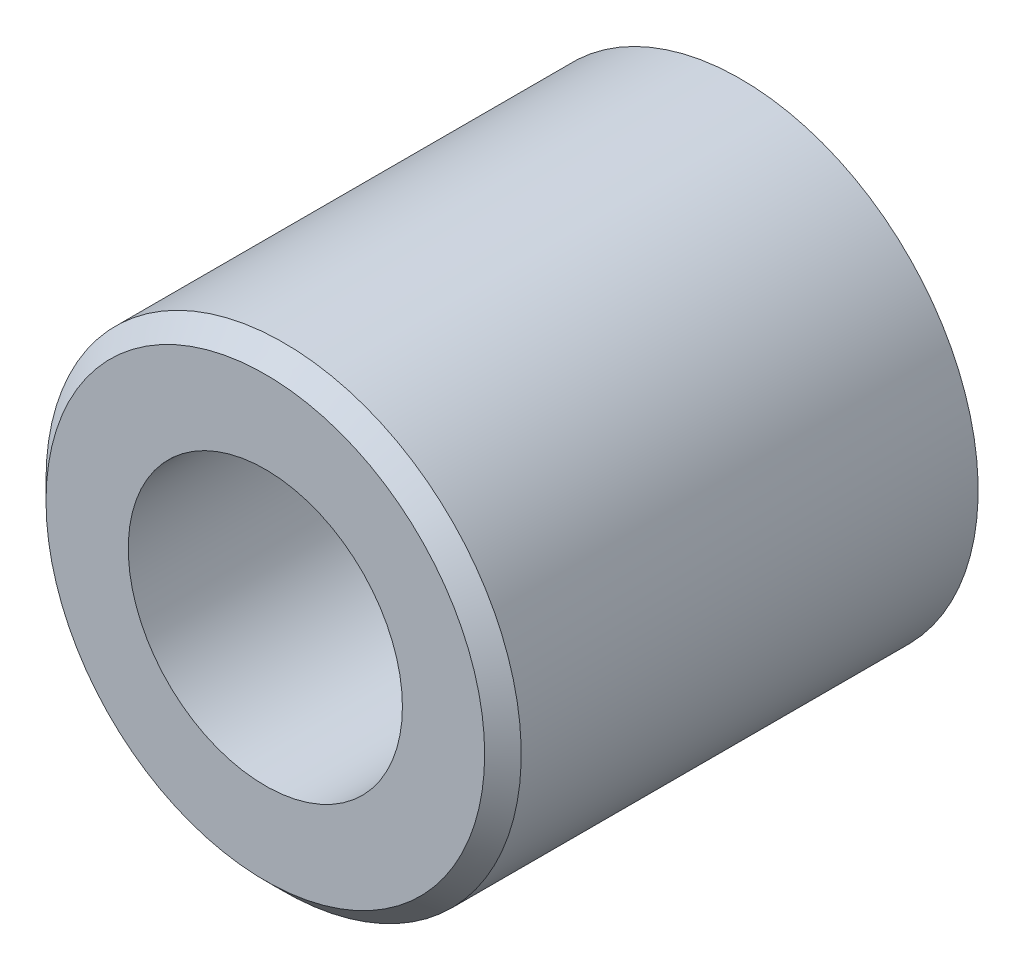
ISO-10303-21;
HEADER;
FILE_DESCRIPTION(('STEP AP214'),'2;1');
FILE_NAME('part.step','',(''),(''),'','','');
FILE_SCHEMA(('AUTOMOTIVE_DESIGN { 1 0 10303 214 1 1 1 1 }'));
ENDSEC;
DATA;
#1=APPLICATION_CONTEXT('core data for automotive mechanical design processes');
#2=APPLICATION_PROTOCOL_DEFINITION('international standard','automotive_design',2000,#1);
#3=PRODUCT_CONTEXT('',#1,'mechanical');
#4=PRODUCT('Part','Part','',(#3));
#5=PRODUCT_RELATED_PRODUCT_CATEGORY('part','',(#4));
#6=PRODUCT_DEFINITION_FORMATION('','',#4);
#7=PRODUCT_DEFINITION_CONTEXT('part definition',#1,'design');
#8=PRODUCT_DEFINITION('design','',#6,#7);
#9=PRODUCT_DEFINITION_SHAPE('','',#8);
#10=(LENGTH_UNIT() NAMED_UNIT(*) SI_UNIT(.MILLI.,.METRE.));
#11=(NAMED_UNIT(*) PLANE_ANGLE_UNIT() SI_UNIT($,.RADIAN.));
#12=(NAMED_UNIT(*) SI_UNIT($,.STERADIAN.) SOLID_ANGLE_UNIT());
#13=UNCERTAINTY_MEASURE_WITH_UNIT(LENGTH_MEASURE(1.E-05),#10,'distance_accuracy_value','');
#14=(GEOMETRIC_REPRESENTATION_CONTEXT(3) GLOBAL_UNCERTAINTY_ASSIGNED_CONTEXT((#13)) GLOBAL_UNIT_ASSIGNED_CONTEXT((#10,
#11,#12)) REPRESENTATION_CONTEXT('',''));
#15=CARTESIAN_POINT('',(0.,0.,0.));
#16=DIRECTION('',(0.,0.,1.));
#17=DIRECTION('',(1.,0.,0.));
#18=AXIS2_PLACEMENT_3D('',#15,#16,#17);
#19=CARTESIAN_POINT('',(0.,0.,0.));
#20=DIRECTION('',(0.,0.,1.));
#21=DIRECTION('',(1.,0.,0.));
#22=AXIS2_PLACEMENT_3D('',#19,#20,#21);
#23=CYLINDRICAL_SURFACE('',#22,3.);
#24=CARTESIAN_POINT('',(0.,0.,0.));
#25=DIRECTION('',(0.,0.,1.));
#26=DIRECTION('',(1.,0.,0.));
#27=AXIS2_PLACEMENT_3D('',#24,#25,#26);
#28=CIRCLE('',#27,3.);
#29=CARTESIAN_POINT('',(3.,0.,0.));
#30=VERTEX_POINT('',#29);
#31=EDGE_CURVE('E47',#30,#30,#28,.T.);
#32=CARTESIAN_POINT('',(0.,0.,5.));
#33=DIRECTION('',(0.,0.,1.));
#34=DIRECTION('',(1.,0.,0.));
#35=AXIS2_PLACEMENT_3D('',#32,#33,#34);
#36=CIRCLE('',#35,3.);
#37=CARTESIAN_POINT('',(3.,0.,5.));
#38=VERTEX_POINT('',#37);
#39=EDGE_CURVE('E38',#38,#38,#36,.F.);
#40=CARTESIAN_POINT('',(3.,0.,0.));
#41=CARTESIAN_POINT('',(3.,0.,0.0520833333333332));
#42=CARTESIAN_POINT('',(3.,0.,0.104166666666667));
#43=CARTESIAN_POINT('',(3.,0.,0.208333333333333));
#44=CARTESIAN_POINT('',(3.,0.,0.260416666666667));
#45=CARTESIAN_POINT('',(3.,0.,0.364583333333333));
#46=CARTESIAN_POINT('',(3.,0.,0.416666666666667));
#47=CARTESIAN_POINT('',(3.,0.,0.520833333333333));
#48=CARTESIAN_POINT('',(3.,0.,0.572916666666666));
#49=CARTESIAN_POINT('',(3.,0.,0.677083333333333));
#50=CARTESIAN_POINT('',(3.,0.,0.729166666666666));
#51=CARTESIAN_POINT('',(3.,0.,0.833333333333333));
#52=CARTESIAN_POINT('',(3.,0.,0.885416666666666));
#53=CARTESIAN_POINT('',(3.,0.,0.989583333333333));
#54=CARTESIAN_POINT('',(3.,0.,1.04166666666667));
#55=CARTESIAN_POINT('',(3.,0.,1.14583333333333));
#56=CARTESIAN_POINT('',(3.,0.,1.19791666666667));
#57=CARTESIAN_POINT('',(3.,0.,1.30208333333333));
#58=CARTESIAN_POINT('',(3.,0.,1.35416666666667));
#59=CARTESIAN_POINT('',(3.,0.,1.45833333333333));
#60=CARTESIAN_POINT('',(3.,0.,1.51041666666667));
#61=CARTESIAN_POINT('',(3.,0.,1.61458333333333));
#62=CARTESIAN_POINT('',(3.,0.,1.66666666666667));
#63=CARTESIAN_POINT('',(3.,0.,1.77083333333333));
#64=CARTESIAN_POINT('',(3.,0.,1.82291666666667));
#65=CARTESIAN_POINT('',(3.,0.,1.92708333333333));
#66=CARTESIAN_POINT('',(3.,0.,1.97916666666667));
#67=CARTESIAN_POINT('',(3.,0.,2.08333333333333));
#68=CARTESIAN_POINT('',(3.,0.,2.13541666666667));
#69=CARTESIAN_POINT('',(3.,0.,2.23958333333333));
#70=CARTESIAN_POINT('',(3.,0.,2.29166666666667));
#71=CARTESIAN_POINT('',(3.,0.,2.39583333333333));
#72=CARTESIAN_POINT('',(3.,0.,2.44791666666667));
#73=CARTESIAN_POINT('',(3.,0.,2.55208333333333));
#74=CARTESIAN_POINT('',(3.,0.,2.60416666666667));
#75=CARTESIAN_POINT('',(3.,0.,2.70833333333333));
#76=CARTESIAN_POINT('',(3.,0.,2.76041666666667));
#77=CARTESIAN_POINT('',(3.,0.,2.86458333333333));
#78=CARTESIAN_POINT('',(3.,0.,2.91666666666667));
#79=CARTESIAN_POINT('',(3.,0.,3.02083333333333));
#80=CARTESIAN_POINT('',(3.,0.,3.07291666666667));
#81=CARTESIAN_POINT('',(3.,0.,3.17708333333333));
#82=CARTESIAN_POINT('',(3.,0.,3.22916666666667));
#83=CARTESIAN_POINT('',(3.,0.,3.33333333333333));
#84=CARTESIAN_POINT('',(3.,0.,3.38541666666667));
#85=CARTESIAN_POINT('',(3.,0.,3.48958333333333));
#86=CARTESIAN_POINT('',(3.,0.,3.54166666666667));
#87=CARTESIAN_POINT('',(3.,0.,3.64583333333333));
#88=CARTESIAN_POINT('',(3.,0.,3.69791666666667));
#89=CARTESIAN_POINT('',(3.,0.,3.80208333333333));
#90=CARTESIAN_POINT('',(3.,0.,3.85416666666667));
#91=CARTESIAN_POINT('',(3.,0.,3.95833333333333));
#92=CARTESIAN_POINT('',(3.,0.,4.01041666666667));
#93=CARTESIAN_POINT('',(3.,0.,4.11458333333333));
#94=CARTESIAN_POINT('',(3.,0.,4.16666666666667));
#95=CARTESIAN_POINT('',(3.,0.,4.27083333333333));
#96=CARTESIAN_POINT('',(3.,0.,4.32291666666667));
#97=CARTESIAN_POINT('',(3.,0.,4.42708333333333));
#98=CARTESIAN_POINT('',(3.,0.,4.47916666666667));
#99=CARTESIAN_POINT('',(3.,0.,4.58333333333333));
#100=CARTESIAN_POINT('',(3.,0.,4.63541666666667));
#101=CARTESIAN_POINT('',(3.,0.,4.73958333333333));
#102=CARTESIAN_POINT('',(3.,0.,4.79166666666666));
#103=CARTESIAN_POINT('',(3.,0.,4.89583333333333));
#104=CARTESIAN_POINT('',(3.,0.,4.94791666666666));
#105=CARTESIAN_POINT('',(3.,0.,5.));
#106=B_SPLINE_CURVE_WITH_KNOTS('',3,(#40,#41,#42,#43,#44,#45,#46,#47,#48,#49,#50,#51,#52,#53,
#54,#55,#56,#57,#58,#59,#60,#61,#62,#63,#64,#65,#66,#67,#68,#69,#70,#71,#72,#73,#74,#75,#76,#77,
#78,#79,#80,#81,#82,#83,#84,#85,#86,#87,#88,#89,#90,#91,#92,#93,#94,#95,#96,#97,#98,#99,#100,
#101,#102,#103,#104,#105),.UNSPECIFIED.,.F.,.F.,(4,2,2,2,2,2,2,2,2,2,2,2,2,2,2,2,2,2,2,2,2,2,2,
2,2,2,2,2,2,2,2,2,4),(0.,0.15625,0.3125,0.46875,0.625,0.78125,0.9375,1.09375,1.25,1.40625,
1.5625,1.71875,1.875,2.03125,2.1875,2.34375,2.5,2.65625,2.8125,2.96875,3.125,3.28125,3.4375,
3.59375,3.75,3.90625,4.0625,4.21875,4.375,4.53125,4.6875,4.84375,5.),.UNSPECIFIED.);
#107=EDGE_CURVE('BSEAM27',#30,#38,#106,.T.);
#108=ORIENTED_EDGE('',*,*,#31,.F.);
#109=ORIENTED_EDGE('',*,*,#39,.F.);
#110=ORIENTED_EDGE('',*,*,#107,.T.);
#111=ORIENTED_EDGE('',*,*,#107,.F.);
#112=EDGE_LOOP('',(#108,#110,#109,#111));
#113=FACE_BOUND('',#112,.T.);
#114=ADVANCED_FACE('F27',(#113),#23,.F.);
#115=CARTESIAN_POINT('',(0.,0.,13.));
#116=DIRECTION('',(0.,0.,-1.));
#117=DIRECTION('',(-1.,0.,0.));
#118=AXIS2_PLACEMENT_3D('',#115,#116,#117);
#119=CYLINDRICAL_SURFACE('',#118,6.5);
#120=CARTESIAN_POINT('',(0.,0.,12.5));
#121=DIRECTION('',(0.,0.,1.));
#122=DIRECTION('',(1.,0.,0.));
#123=AXIS2_PLACEMENT_3D('',#120,#121,#122);
#124=CIRCLE('',#123,6.5);
#125=CARTESIAN_POINT('',(-6.5,0.,12.5));
#126=VERTEX_POINT('',#125);
#127=EDGE_CURVE('E10',#126,#126,#124,.F.);
#128=CARTESIAN_POINT('',(0.,0.,0.));
#129=DIRECTION('',(0.,0.,1.));
#130=DIRECTION('',(1.,0.,0.));
#131=AXIS2_PLACEMENT_3D('',#128,#129,#130);
#132=CIRCLE('',#131,6.5);
#133=CARTESIAN_POINT('',(-6.5,0.,0.));
#134=VERTEX_POINT('',#133);
#135=EDGE_CURVE('E42',#134,#134,#132,.T.);
#136=CARTESIAN_POINT('',(-6.5,0.,12.5));
#137=CARTESIAN_POINT('',(-6.5,0.,12.3697916666667));
#138=CARTESIAN_POINT('',(-6.5,0.,12.2395833333333));
#139=CARTESIAN_POINT('',(-6.5,0.,11.9791666666667));
#140=CARTESIAN_POINT('',(-6.5,0.,11.8489583333333));
#141=CARTESIAN_POINT('',(-6.5,0.,11.5885416666667));
#142=CARTESIAN_POINT('',(-6.5,0.,11.4583333333333));
#143=CARTESIAN_POINT('',(-6.5,0.,11.1979166666667));
#144=CARTESIAN_POINT('',(-6.5,0.,11.0677083333333));
#145=CARTESIAN_POINT('',(-6.5,0.,10.8072916666667));
#146=CARTESIAN_POINT('',(-6.5,0.,10.6770833333333));
#147=CARTESIAN_POINT('',(-6.5,0.,10.4166666666667));
#148=CARTESIAN_POINT('',(-6.5,0.,10.2864583333333));
#149=CARTESIAN_POINT('',(-6.5,0.,10.0260416666667));
#150=CARTESIAN_POINT('',(-6.5,0.,9.89583333333333));
#151=CARTESIAN_POINT('',(-6.5,0.,9.63541666666666));
#152=CARTESIAN_POINT('',(-6.5,0.,9.50520833333333));
#153=CARTESIAN_POINT('',(-6.5,0.,9.24479166666666));
#154=CARTESIAN_POINT('',(-6.5,0.,9.11458333333333));
#155=CARTESIAN_POINT('',(-6.5,0.,8.85416666666666));
#156=CARTESIAN_POINT('',(-6.5,0.,8.72395833333333));
#157=CARTESIAN_POINT('',(-6.5,0.,8.46354166666666));
#158=CARTESIAN_POINT('',(-6.5,0.,8.33333333333333));
#159=CARTESIAN_POINT('',(-6.5,0.,8.07291666666666));
#160=CARTESIAN_POINT('',(-6.5,0.,7.94270833333333));
#161=CARTESIAN_POINT('',(-6.5,0.,7.68229166666666));
#162=CARTESIAN_POINT('',(-6.5,0.,7.55208333333333));
#163=CARTESIAN_POINT('',(-6.5,0.,7.29166666666666));
#164=CARTESIAN_POINT('',(-6.5,0.,7.16145833333333));
#165=CARTESIAN_POINT('',(-6.5,0.,6.90104166666666));
#166=CARTESIAN_POINT('',(-6.5,0.,6.77083333333333));
#167=CARTESIAN_POINT('',(-6.5,0.,6.51041666666666));
#168=CARTESIAN_POINT('',(-6.5,0.,6.38020833333333));
#169=CARTESIAN_POINT('',(-6.5,0.,6.11979166666666));
#170=CARTESIAN_POINT('',(-6.5,0.,5.98958333333333));
#171=CARTESIAN_POINT('',(-6.5,0.,5.72916666666666));
#172=CARTESIAN_POINT('',(-6.5,0.,5.59895833333333));
#173=CARTESIAN_POINT('',(-6.5,0.,5.33854166666666));
#174=CARTESIAN_POINT('',(-6.5,0.,5.20833333333333));
#175=CARTESIAN_POINT('',(-6.5,0.,4.94791666666667));
#176=CARTESIAN_POINT('',(-6.5,0.,4.81770833333333));
#177=CARTESIAN_POINT('',(-6.5,0.,4.55729166666666));
#178=CARTESIAN_POINT('',(-6.5,0.,4.42708333333333));
#179=CARTESIAN_POINT('',(-6.5,0.,4.16666666666667));
#180=CARTESIAN_POINT('',(-6.5,0.,4.03645833333333));
#181=CARTESIAN_POINT('',(-6.5,0.,3.77604166666667));
#182=CARTESIAN_POINT('',(-6.5,0.,3.64583333333333));
#183=CARTESIAN_POINT('',(-6.5,0.,3.38541666666667));
#184=CARTESIAN_POINT('',(-6.5,0.,3.25520833333333));
#185=CARTESIAN_POINT('',(-6.5,0.,2.99479166666667));
#186=CARTESIAN_POINT('',(-6.5,0.,2.86458333333333));
#187=CARTESIAN_POINT('',(-6.5,0.,2.60416666666666));
#188=CARTESIAN_POINT('',(-6.5,0.,2.47395833333333));
#189=CARTESIAN_POINT('',(-6.5,0.,2.21354166666667));
#190=CARTESIAN_POINT('',(-6.5,0.,2.08333333333333));
#191=CARTESIAN_POINT('',(-6.5,0.,1.82291666666667));
#192=CARTESIAN_POINT('',(-6.5,0.,1.69270833333333));
#193=CARTESIAN_POINT('',(-6.5,0.,1.43229166666666));
#194=CARTESIAN_POINT('',(-6.5,0.,1.30208333333333));
#195=CARTESIAN_POINT('',(-6.5,0.,1.04166666666667));
#196=CARTESIAN_POINT('',(-6.5,0.,0.911458333333334));
#197=CARTESIAN_POINT('',(-6.5,0.,0.651041666666667));
#198=CARTESIAN_POINT('',(-6.5,0.,0.520833333333333));
#199=CARTESIAN_POINT('',(-6.5,0.,0.260416666666666));
#200=CARTESIAN_POINT('',(-6.5,0.,0.130208333333333));
#201=CARTESIAN_POINT('',(-6.5,0.,0.));
#202=B_SPLINE_CURVE_WITH_KNOTS('',3,(#136,#137,#138,#139,#140,#141,#142,#143,#144,#145,#146,
#147,#148,#149,#150,#151,#152,#153,#154,#155,#156,#157,#158,#159,#160,#161,#162,#163,#164,#165,
#166,#167,#168,#169,#170,#171,#172,#173,#174,#175,#176,#177,#178,#179,#180,#181,#182,#183,#184,
#185,#186,#187,#188,#189,#190,#191,#192,#193,#194,#195,#196,#197,#198,#199,#200,#201),
.UNSPECIFIED.,.F.,.F.,(4,2,2,2,2,2,2,2,2,2,2,2,2,2,2,2,2,2,2,2,2,2,2,2,2,2,2,2,2,2,2,2,4),(0.,
0.390625,0.781250000000001,1.171875,1.5625,1.953125,2.34375,2.734375,3.125,3.515625,3.90625,
4.296875,4.6875,5.078125,5.46875,5.859375,6.25,6.640625,7.03125,7.421875,7.8125,8.203125,
8.59374999999999,8.984375,9.375,9.765625,10.15625,10.546875,10.9375,11.328125,11.71875,
12.109375,12.5),.UNSPECIFIED.);
#203=EDGE_CURVE('BSEAM29',#126,#134,#202,.T.);
#204=ORIENTED_EDGE('',*,*,#127,.T.);
#205=ORIENTED_EDGE('',*,*,#135,.T.);
#206=ORIENTED_EDGE('',*,*,#203,.T.);
#207=ORIENTED_EDGE('',*,*,#203,.F.);
#208=EDGE_LOOP('',(#204,#206,#205,#207));
#209=FACE_BOUND('',#208,.T.);
#210=ADVANCED_FACE('F29',(#209),#119,.T.);
#211=CARTESIAN_POINT('',(0.,0.,13.));
#212=DIRECTION('',(0.,0.,1.));
#213=DIRECTION('',(1.,0.,0.));
#214=AXIS2_PLACEMENT_3D('',#211,#212,#213);
#215=PLANE('',#214);
#216=CARTESIAN_POINT('',(0.,0.,13.));
#217=DIRECTION('',(0.,0.,1.));
#218=DIRECTION('',(1.,0.,0.));
#219=AXIS2_PLACEMENT_3D('',#216,#217,#218);
#220=CIRCLE('',#219,5.99999999999999);
#221=CARTESIAN_POINT('',(5.99999999999999,0.,13.));
#222=VERTEX_POINT('',#221);
#223=EDGE_CURVE('E34',#222,#222,#220,.T.);
#224=ORIENTED_EDGE('',*,*,#223,.T.);
#225=EDGE_LOOP('',(#224));
#226=FACE_BOUND('',#225,.T.);
#227=CARTESIAN_POINT('',(0.,0.,13.));
#228=DIRECTION('',(0.,0.,1.));
#229=DIRECTION('',(1.,0.,0.));
#230=AXIS2_PLACEMENT_3D('',#227,#228,#229);
#231=CIRCLE('',#230,3.75);
#232=CARTESIAN_POINT('',(3.75,0.,13.));
#233=VERTEX_POINT('',#232);
#234=EDGE_CURVE('E53',#233,#233,#231,.T.);
#235=ORIENTED_EDGE('',*,*,#234,.F.);
#236=EDGE_LOOP('',(#235));
#237=FACE_BOUND('',#236,.T.);
#238=ADVANCED_FACE('F59',(#226,#237),#215,.T.);
#239=CARTESIAN_POINT('',(0.,0.,0.));
#240=DIRECTION('',(0.,0.,1.));
#241=DIRECTION('',(1.,0.,0.));
#242=AXIS2_PLACEMENT_3D('',#239,#240,#241);
#243=PLANE('',#242);
#244=ORIENTED_EDGE('',*,*,#31,.T.);
#245=EDGE_LOOP('',(#244));
#246=FACE_BOUND('',#245,.T.);
#247=ORIENTED_EDGE('',*,*,#135,.F.);
#248=EDGE_LOOP('',(#247));
#249=FACE_BOUND('',#248,.T.);
#250=ADVANCED_FACE('F61',(#246,#249),#243,.F.);
#251=CARTESIAN_POINT('',(0.,0.,5.));
#252=DIRECTION('',(0.,0.,1.));
#253=DIRECTION('',(1.,0.,0.));
#254=AXIS2_PLACEMENT_3D('',#251,#252,#253);
#255=PLANE('',#254);
#256=CARTESIAN_POINT('',(0.,0.,5.));
#257=DIRECTION('',(0.,0.,1.));
#258=DIRECTION('',(1.,0.,0.));
#259=AXIS2_PLACEMENT_3D('',#256,#257,#258);
#260=CIRCLE('',#259,3.75);
#261=CARTESIAN_POINT('',(3.75,0.,5.));
#262=VERTEX_POINT('',#261);
#263=EDGE_CURVE('E50',#262,#262,#260,.T.);
#264=ORIENTED_EDGE('',*,*,#263,.T.);
#265=EDGE_LOOP('',(#264));
#266=FACE_BOUND('',#265,.T.);
#267=ORIENTED_EDGE('',*,*,#39,.T.);
#268=EDGE_LOOP('',(#267));
#269=FACE_BOUND('',#268,.T.);
#270=ADVANCED_FACE('F66',(#266,#269),#255,.T.);
#271=CARTESIAN_POINT('',(0.,0.,5.));
#272=DIRECTION('',(0.,0.,1.));
#273=DIRECTION('',(1.,0.,0.));
#274=AXIS2_PLACEMENT_3D('',#271,#272,#273);
#275=CYLINDRICAL_SURFACE('',#274,3.75);
#276=ORIENTED_EDGE('',*,*,#263,.F.);
#277=EDGE_LOOP('',(#276));
#278=FACE_BOUND('',#277,.T.);
#279=ORIENTED_EDGE('',*,*,#234,.T.);
#280=EDGE_LOOP('',(#279));
#281=FACE_BOUND('',#280,.T.);
#282=ADVANCED_FACE('F57',(#278,#281),#275,.F.);
#283=CARTESIAN_POINT('',(0.,0.,13.));
#284=DIRECTION('',(0.,0.,-1.));
#285=DIRECTION('',(-1.,0.,0.));
#286=AXIS2_PLACEMENT_3D('',#283,#284,#285);
#287=CONICAL_SURFACE('',#286,5.99999999999999,0.785398163397453);
#288=ORIENTED_EDGE('',*,*,#127,.F.);
#289=EDGE_LOOP('',(#288));
#290=FACE_BOUND('',#289,.T.);
#291=ORIENTED_EDGE('',*,*,#223,.F.);
#292=EDGE_LOOP('',(#291));
#293=FACE_BOUND('',#292,.T.);
#294=ADVANCED_FACE('F79',(#290,#293),#287,.T.);
#295=CLOSED_SHELL('',(#114,#210,#238,#250,#270,#282,#294));
#296=MANIFOLD_SOLID_BREP('B2',#295);
#297=ADVANCED_BREP_SHAPE_REPRESENTATION('',(#18,#296),#14);
#298=SHAPE_DEFINITION_REPRESENTATION(#9,#297);
ENDSEC;
END-ISO-10303-21;
